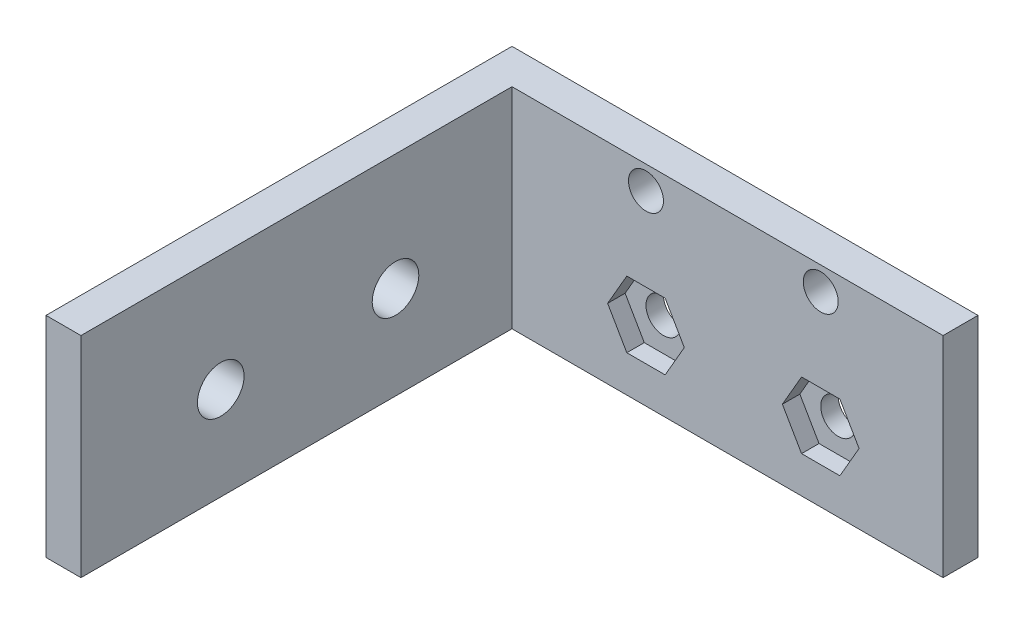
ISO-10303-21;
HEADER;
FILE_DESCRIPTION(('STEP AP214'),'2;1');
FILE_NAME('part.step','',(''),(''),'','','');
FILE_SCHEMA(('AUTOMOTIVE_DESIGN { 1 0 10303 214 1 1 1 1 }'));
ENDSEC;
DATA;
#1=APPLICATION_CONTEXT('core data for automotive mechanical design processes');
#2=APPLICATION_PROTOCOL_DEFINITION('international standard','automotive_design',2000,#1);
#3=PRODUCT_CONTEXT('',#1,'mechanical');
#4=PRODUCT('Part','Part','',(#3));
#5=PRODUCT_RELATED_PRODUCT_CATEGORY('part','',(#4));
#6=PRODUCT_DEFINITION_FORMATION('','',#4);
#7=PRODUCT_DEFINITION_CONTEXT('part definition',#1,'design');
#8=PRODUCT_DEFINITION('design','',#6,#7);
#9=PRODUCT_DEFINITION_SHAPE('','',#8);
#10=(LENGTH_UNIT() NAMED_UNIT(*) SI_UNIT(.MILLI.,.METRE.));
#11=(NAMED_UNIT(*) PLANE_ANGLE_UNIT() SI_UNIT($,.RADIAN.));
#12=(NAMED_UNIT(*) SI_UNIT($,.STERADIAN.) SOLID_ANGLE_UNIT());
#13=UNCERTAINTY_MEASURE_WITH_UNIT(LENGTH_MEASURE(1.E-05),#10,'distance_accuracy_value','');
#14=(GEOMETRIC_REPRESENTATION_CONTEXT(3) GLOBAL_UNCERTAINTY_ASSIGNED_CONTEXT((#13)) GLOBAL_UNIT_ASSIGNED_CONTEXT((#10,
#11,#12)) REPRESENTATION_CONTEXT('',''));
#15=CARTESIAN_POINT('',(0.,0.,0.));
#16=DIRECTION('',(0.,0.,1.));
#17=DIRECTION('',(1.,0.,0.));
#18=AXIS2_PLACEMENT_3D('',#15,#16,#17);
#19=CARTESIAN_POINT('',(29.5,6.,0.));
#20=DIRECTION('',(0.,0.,1.));
#21=DIRECTION('',(1.,0.,0.));
#22=AXIS2_PLACEMENT_3D('',#19,#20,#21);
#23=CYLINDRICAL_SURFACE('',#22,1.5);
#24=CARTESIAN_POINT('',(29.5,6.,0.));
#25=DIRECTION('',(0.,0.,1.));
#26=DIRECTION('',(1.,0.,0.));
#27=AXIS2_PLACEMENT_3D('',#24,#25,#26);
#28=CIRCLE('',#27,1.5);
#29=CARTESIAN_POINT('',(31.,6.,0.));
#30=VERTEX_POINT('',#29);
#31=EDGE_CURVE('E272',#30,#30,#28,.T.);
#32=ORIENTED_EDGE('',*,*,#31,.F.);
#33=EDGE_LOOP('',(#32));
#34=FACE_BOUND('',#33,.T.);
#35=CARTESIAN_POINT('',(29.5,6.,1.5));
#36=DIRECTION('',(0.,0.,1.));
#37=DIRECTION('',(1.,0.,0.));
#38=AXIS2_PLACEMENT_3D('',#35,#36,#37);
#39=CIRCLE('',#38,1.5);
#40=CARTESIAN_POINT('',(31.,6.,1.5));
#41=VERTEX_POINT('',#40);
#42=EDGE_CURVE('E37',#41,#41,#39,.F.);
#43=ORIENTED_EDGE('',*,*,#42,.F.);
#44=EDGE_LOOP('',(#43));
#45=FACE_BOUND('',#44,.T.);
#46=ADVANCED_FACE('F33',(#34,#45),#23,.F.);
#47=CARTESIAN_POINT('',(14.5,6.,0.));
#48=DIRECTION('',(0.,0.,1.));
#49=DIRECTION('',(1.,0.,0.));
#50=AXIS2_PLACEMENT_3D('',#47,#48,#49);
#51=CYLINDRICAL_SURFACE('',#50,1.5);
#52=CARTESIAN_POINT('',(14.5,6.,0.));
#53=DIRECTION('',(0.,0.,1.));
#54=DIRECTION('',(1.,0.,0.));
#55=AXIS2_PLACEMENT_3D('',#52,#53,#54);
#56=CIRCLE('',#55,1.5);
#57=CARTESIAN_POINT('',(16.,6.,0.));
#58=VERTEX_POINT('',#57);
#59=EDGE_CURVE('E282',#58,#58,#56,.T.);
#60=ORIENTED_EDGE('',*,*,#59,.F.);
#61=EDGE_LOOP('',(#60));
#62=FACE_BOUND('',#61,.T.);
#63=CARTESIAN_POINT('',(14.5,6.,1.5));
#64=DIRECTION('',(0.,0.,1.));
#65=DIRECTION('',(1.,0.,0.));
#66=AXIS2_PLACEMENT_3D('',#63,#64,#65);
#67=CIRCLE('',#66,1.5);
#68=CARTESIAN_POINT('',(16.,6.,1.5));
#69=VERTEX_POINT('',#68);
#70=EDGE_CURVE('E252',#69,#69,#67,.F.);
#71=ORIENTED_EDGE('',*,*,#70,.F.);
#72=EDGE_LOOP('',(#71));
#73=FACE_BOUND('',#72,.T.);
#74=ADVANCED_FACE('F338',(#62,#73),#51,.F.);
#75=CARTESIAN_POINT('',(0.,0.,3.));
#76=DIRECTION('',(0.,0.,-1.));
#77=DIRECTION('',(-1.,0.,0.));
#78=AXIS2_PLACEMENT_3D('',#75,#76,#77);
#79=PLANE('',#78);
#80=DIRECTION('',(-1.,0.,0.));
#81=VECTOR('',#80,1.);
#82=CARTESIAN_POINT('',(31.1454482671904,8.85,3.));
#83=LINE('',#82,#81);
#84=CARTESIAN_POINT('',(31.1454482671904,8.85,3.));
#85=VERTEX_POINT('',#84);
#86=CARTESIAN_POINT('',(27.8545517328096,8.85,3.));
#87=VERTEX_POINT('',#86);
#88=EDGE_CURVE('E196',#85,#87,#83,.T.);
#89=ORIENTED_EDGE('',*,*,#88,.F.);
#90=DIRECTION('',(-0.5,0.866025403784439,0.));
#91=VECTOR('',#90,1.);
#92=CARTESIAN_POINT('',(32.7908965343809,6.,3.));
#93=LINE('',#92,#91);
#94=CARTESIAN_POINT('',(32.7908965343809,6.,3.));
#95=VERTEX_POINT('',#94);
#96=EDGE_CURVE('E50',#95,#85,#93,.T.);
#97=ORIENTED_EDGE('',*,*,#96,.F.);
#98=DIRECTION('',(0.499999999999998,0.86602540378444,0.));
#99=VECTOR('',#98,1.);
#100=CARTESIAN_POINT('',(31.1454482671904,3.15,3.));
#101=LINE('',#100,#99);
#102=CARTESIAN_POINT('',(31.1454482671904,3.15,3.));
#103=VERTEX_POINT('',#102);
#104=EDGE_CURVE('E182',#103,#95,#101,.T.);
#105=ORIENTED_EDGE('',*,*,#104,.F.);
#106=DIRECTION('',(1.,0.,0.));
#107=VECTOR('',#106,1.);
#108=CARTESIAN_POINT('',(27.8545517328096,3.15,3.));
#109=LINE('',#108,#107);
#110=CARTESIAN_POINT('',(27.8545517328096,3.15,3.));
#111=VERTEX_POINT('',#110);
#112=EDGE_CURVE('E185',#111,#103,#109,.T.);
#113=ORIENTED_EDGE('',*,*,#112,.F.);
#114=DIRECTION('',(0.5,-0.866025403784439,0.));
#115=VECTOR('',#114,1.);
#116=CARTESIAN_POINT('',(26.2091034656191,6.00000000000001,3.));
#117=LINE('',#116,#115);
#118=CARTESIAN_POINT('',(26.2091034656191,6.00000000000001,3.));
#119=VERTEX_POINT('',#118);
#120=EDGE_CURVE('E201',#119,#111,#117,.T.);
#121=ORIENTED_EDGE('',*,*,#120,.F.);
#122=DIRECTION('',(-0.500000000000001,-0.866025403784438,0.));
#123=VECTOR('',#122,1.);
#124=CARTESIAN_POINT('',(27.8545517328096,8.85,3.));
#125=LINE('',#124,#123);
#126=EDGE_CURVE('E198',#87,#119,#125,.T.);
#127=ORIENTED_EDGE('',*,*,#126,.F.);
#128=EDGE_LOOP('',(#89,#97,#105,#113,#121,#127));
#129=FACE_BOUND('',#128,.T.);
#130=DIRECTION('',(-1.,0.,0.));
#131=VECTOR('',#130,1.);
#132=CARTESIAN_POINT('',(16.1454482671904,8.85,3.));
#133=LINE('',#132,#131);
#134=CARTESIAN_POINT('',(16.1454482671904,8.85,3.));
#135=VERTEX_POINT('',#134);
#136=CARTESIAN_POINT('',(12.8545517328096,8.85,3.));
#137=VERTEX_POINT('',#136);
#138=EDGE_CURVE('E236',#135,#137,#133,.T.);
#139=ORIENTED_EDGE('',*,*,#138,.F.);
#140=DIRECTION('',(-0.5,0.866025403784438,0.));
#141=VECTOR('',#140,1.);
#142=CARTESIAN_POINT('',(17.7908965343809,6.,3.));
#143=LINE('',#142,#141);
#144=CARTESIAN_POINT('',(17.7908965343809,6.,3.));
#145=VERTEX_POINT('',#144);
#146=EDGE_CURVE('E58',#145,#135,#143,.T.);
#147=ORIENTED_EDGE('',*,*,#146,.F.);
#148=DIRECTION('',(0.5,0.866025403784439,0.));
#149=VECTOR('',#148,1.);
#150=CARTESIAN_POINT('',(16.1454482671904,3.15,3.));
#151=LINE('',#150,#149);
#152=CARTESIAN_POINT('',(16.1454482671904,3.15,3.));
#153=VERTEX_POINT('',#152);
#154=EDGE_CURVE('E219',#153,#145,#151,.T.);
#155=ORIENTED_EDGE('',*,*,#154,.F.);
#156=DIRECTION('',(1.,0.,0.));
#157=VECTOR('',#156,1.);
#158=CARTESIAN_POINT('',(12.8545517328096,3.15,3.));
#159=LINE('',#158,#157);
#160=CARTESIAN_POINT('',(12.8545517328096,3.15,3.));
#161=VERTEX_POINT('',#160);
#162=EDGE_CURVE('E245',#161,#153,#159,.T.);
#163=ORIENTED_EDGE('',*,*,#162,.F.);
#164=DIRECTION('',(0.5,-0.866025403784439,0.));
#165=VECTOR('',#164,1.);
#166=CARTESIAN_POINT('',(11.2091034656191,6.,3.));
#167=LINE('',#166,#165);
#168=CARTESIAN_POINT('',(11.2091034656191,6.,3.));
#169=VERTEX_POINT('',#168);
#170=EDGE_CURVE('E242',#169,#161,#167,.T.);
#171=ORIENTED_EDGE('',*,*,#170,.F.);
#172=DIRECTION('',(-0.5,-0.866025403784439,0.));
#173=VECTOR('',#172,1.);
#174=CARTESIAN_POINT('',(12.8545517328096,8.85,3.));
#175=LINE('',#174,#173);
#176=EDGE_CURVE('E239',#137,#169,#175,.T.);
#177=ORIENTED_EDGE('',*,*,#176,.F.);
#178=EDGE_LOOP('',(#139,#147,#155,#163,#171,#177));
#179=FACE_BOUND('',#178,.T.);
#180=CARTESIAN_POINT('',(29.5,16.,3.));
#181=DIRECTION('',(0.,0.,1.));
#182=DIRECTION('',(1.,0.,0.));
#183=AXIS2_PLACEMENT_3D('',#180,#181,#182);
#184=CIRCLE('',#183,1.5);
#185=CARTESIAN_POINT('',(31.,16.,3.));
#186=VERTEX_POINT('',#185);
#187=EDGE_CURVE('E279',#186,#186,#184,.T.);
#188=ORIENTED_EDGE('',*,*,#187,.F.);
#189=EDGE_LOOP('',(#188));
#190=FACE_BOUND('',#189,.T.);
#191=CARTESIAN_POINT('',(14.5,16.,3.));
#192=DIRECTION('',(0.,0.,1.));
#193=DIRECTION('',(1.,0.,0.));
#194=AXIS2_PLACEMENT_3D('',#191,#192,#193);
#195=CIRCLE('',#194,1.49999999999999);
#196=CARTESIAN_POINT('',(16.,16.,3.));
#197=VERTEX_POINT('',#196);
#198=EDGE_CURVE('E278',#197,#197,#195,.T.);
#199=ORIENTED_EDGE('',*,*,#198,.F.);
#200=EDGE_LOOP('',(#199));
#201=FACE_BOUND('',#200,.T.);
#202=DIRECTION('',(0.,1.,0.));
#203=VECTOR('',#202,1.);
#204=CARTESIAN_POINT('',(3.,18.,3.));
#205=LINE('',#204,#203);
#206=CARTESIAN_POINT('',(3.,0.,3.));
#207=VERTEX_POINT('',#206);
#208=CARTESIAN_POINT('',(3.,18.,3.));
#209=VERTEX_POINT('',#208);
#210=EDGE_CURVE('E290',#207,#209,#205,.T.);
#211=ORIENTED_EDGE('',*,*,#210,.F.);
#212=DIRECTION('',(1.,0.,0.));
#213=VECTOR('',#212,1.);
#214=CARTESIAN_POINT('',(0.,0.,3.));
#215=LINE('',#214,#213);
#216=CARTESIAN_POINT('',(40.,0.,3.));
#217=VERTEX_POINT('',#216);
#218=EDGE_CURVE('E312',#207,#217,#215,.T.);
#219=ORIENTED_EDGE('',*,*,#218,.T.);
#220=DIRECTION('',(0.,1.,0.));
#221=VECTOR('',#220,1.);
#222=CARTESIAN_POINT('',(40.,0.,3.));
#223=LINE('',#222,#221);
#224=CARTESIAN_POINT('',(40.,18.,3.));
#225=VERTEX_POINT('',#224);
#226=EDGE_CURVE('E314',#217,#225,#223,.T.);
#227=ORIENTED_EDGE('',*,*,#226,.T.);
#228=DIRECTION('',(-1.,0.,0.));
#229=VECTOR('',#228,1.);
#230=CARTESIAN_POINT('',(0.,18.,3.));
#231=LINE('',#230,#229);
#232=EDGE_CURVE('E317',#225,#209,#231,.T.);
#233=ORIENTED_EDGE('',*,*,#232,.T.);
#234=EDGE_LOOP('',(#211,#219,#227,#233));
#235=FACE_BOUND('',#234,.T.);
#236=ADVANCED_FACE('F340',(#129,#179,#190,#201,#235),#79,.F.);
#237=CARTESIAN_POINT('',(0.,0.,3.));
#238=DIRECTION('',(1.,0.,0.));
#239=DIRECTION('',(0.,0.,-1.));
#240=AXIS2_PLACEMENT_3D('',#237,#238,#239);
#241=PLANE('',#240);
#242=CARTESIAN_POINT('',(0.,8.,13.));
#243=DIRECTION('',(1.,0.,0.));
#244=DIRECTION('',(0.,1.,0.));
#245=AXIS2_PLACEMENT_3D('',#242,#243,#244);
#246=CIRCLE('',#245,2.);
#247=CARTESIAN_POINT('',(0.,10.,13.));
#248=VERTEX_POINT('',#247);
#249=EDGE_CURVE('E262',#248,#248,#246,.T.);
#250=ORIENTED_EDGE('',*,*,#249,.T.);
#251=EDGE_LOOP('',(#250));
#252=FACE_BOUND('',#251,.T.);
#253=CARTESIAN_POINT('',(0.,8.,28.));
#254=DIRECTION('',(1.,0.,0.));
#255=DIRECTION('',(0.,1.,0.));
#256=AXIS2_PLACEMENT_3D('',#253,#254,#255);
#257=CIRCLE('',#256,2.);
#258=CARTESIAN_POINT('',(0.,10.,28.));
#259=VERTEX_POINT('',#258);
#260=EDGE_CURVE('E269',#259,#259,#257,.T.);
#261=ORIENTED_EDGE('',*,*,#260,.T.);
#262=EDGE_LOOP('',(#261));
#263=FACE_BOUND('',#262,.T.);
#264=DIRECTION('',(0.,-1.,0.));
#265=VECTOR('',#264,1.);
#266=CARTESIAN_POINT('',(0.,0.,0.));
#267=LINE('',#266,#265);
#268=CARTESIAN_POINT('',(0.,18.,0.));
#269=VERTEX_POINT('',#268);
#270=CARTESIAN_POINT('',(0.,0.,0.));
#271=VERTEX_POINT('',#270);
#272=EDGE_CURVE('E311',#269,#271,#267,.T.);
#273=ORIENTED_EDGE('',*,*,#272,.T.);
#274=DIRECTION('',(0.,0.,-1.));
#275=VECTOR('',#274,1.);
#276=CARTESIAN_POINT('',(0.,0.,3.));
#277=LINE('',#276,#275);
#278=CARTESIAN_POINT('',(0.,0.,40.));
#279=VERTEX_POINT('',#278);
#280=EDGE_CURVE('E11',#279,#271,#277,.T.);
#281=ORIENTED_EDGE('',*,*,#280,.F.);
#282=DIRECTION('',(0.,-1.,0.));
#283=VECTOR('',#282,1.);
#284=CARTESIAN_POINT('',(0.,18.,40.));
#285=LINE('',#284,#283);
#286=CARTESIAN_POINT('',(0.,18.,40.));
#287=VERTEX_POINT('',#286);
#288=EDGE_CURVE('E293',#287,#279,#285,.T.);
#289=ORIENTED_EDGE('',*,*,#288,.F.);
#290=DIRECTION('',(0.,0.,-1.));
#291=VECTOR('',#290,1.);
#292=CARTESIAN_POINT('',(0.,18.,3.));
#293=LINE('',#292,#291);
#294=EDGE_CURVE('E319',#287,#269,#293,.T.);
#295=ORIENTED_EDGE('',*,*,#294,.T.);
#296=EDGE_LOOP('',(#273,#281,#289,#295));
#297=FACE_BOUND('',#296,.T.);
#298=ADVANCED_FACE('F35',(#252,#263,#297),#241,.F.);
#299=CARTESIAN_POINT('',(0.,0.,3.));
#300=DIRECTION('',(0.,1.,0.));
#301=DIRECTION('',(0.,0.,1.));
#302=AXIS2_PLACEMENT_3D('',#299,#300,#301);
#303=PLANE('',#302);
#304=DIRECTION('',(1.,0.,0.));
#305=VECTOR('',#304,1.);
#306=CARTESIAN_POINT('',(0.,0.,0.));
#307=LINE('',#306,#305);
#308=CARTESIAN_POINT('',(40.,0.,0.));
#309=VERTEX_POINT('',#308);
#310=EDGE_CURVE('E322',#271,#309,#307,.T.);
#311=ORIENTED_EDGE('',*,*,#310,.T.);
#312=DIRECTION('',(0.,0.,-1.));
#313=VECTOR('',#312,1.);
#314=CARTESIAN_POINT('',(40.,0.,3.));
#315=LINE('',#314,#313);
#316=EDGE_CURVE('E42',#217,#309,#315,.T.);
#317=ORIENTED_EDGE('',*,*,#316,.F.);
#318=ORIENTED_EDGE('',*,*,#218,.F.);
#319=DIRECTION('',(0.,0.,-1.));
#320=VECTOR('',#319,1.);
#321=CARTESIAN_POINT('',(3.,0.,40.));
#322=LINE('',#321,#320);
#323=CARTESIAN_POINT('',(3.,0.,40.));
#324=VERTEX_POINT('',#323);
#325=EDGE_CURVE('E308',#324,#207,#322,.T.);
#326=ORIENTED_EDGE('',*,*,#325,.F.);
#327=DIRECTION('',(1.,0.,0.));
#328=VECTOR('',#327,1.);
#329=CARTESIAN_POINT('',(0.,0.,40.));
#330=LINE('',#329,#328);
#331=EDGE_CURVE('E296',#279,#324,#330,.T.);
#332=ORIENTED_EDGE('',*,*,#331,.F.);
#333=ORIENTED_EDGE('',*,*,#280,.T.);
#334=EDGE_LOOP('',(#311,#317,#318,#326,#332,#333));
#335=FACE_BOUND('',#334,.T.);
#336=ADVANCED_FACE('F378',(#335),#303,.F.);
#337=CARTESIAN_POINT('',(40.,0.,3.));
#338=DIRECTION('',(-1.,0.,0.));
#339=DIRECTION('',(0.,0.,1.));
#340=AXIS2_PLACEMENT_3D('',#337,#338,#339);
#341=PLANE('',#340);
#342=DIRECTION('',(0.,1.,0.));
#343=VECTOR('',#342,1.);
#344=CARTESIAN_POINT('',(40.,0.,0.));
#345=LINE('',#344,#343);
#346=CARTESIAN_POINT('',(40.,18.,0.));
#347=VERTEX_POINT('',#346);
#348=EDGE_CURVE('E324',#309,#347,#345,.T.);
#349=ORIENTED_EDGE('',*,*,#348,.T.);
#350=DIRECTION('',(0.,0.,-1.));
#351=VECTOR('',#350,1.);
#352=CARTESIAN_POINT('',(40.,18.,3.));
#353=LINE('',#352,#351);
#354=EDGE_CURVE('E329',#225,#347,#353,.T.);
#355=ORIENTED_EDGE('',*,*,#354,.F.);
#356=ORIENTED_EDGE('',*,*,#226,.F.);
#357=ORIENTED_EDGE('',*,*,#316,.T.);
#358=EDGE_LOOP('',(#349,#355,#356,#357));
#359=FACE_BOUND('',#358,.T.);
#360=ADVANCED_FACE('F375',(#359),#341,.F.);
#361=CARTESIAN_POINT('',(0.,18.,3.));
#362=DIRECTION('',(0.,-1.,0.));
#363=DIRECTION('',(0.,0.,-1.));
#364=AXIS2_PLACEMENT_3D('',#361,#362,#363);
#365=PLANE('',#364);
#366=DIRECTION('',(-1.,0.,0.));
#367=VECTOR('',#366,1.);
#368=CARTESIAN_POINT('',(0.,18.,0.));
#369=LINE('',#368,#367);
#370=EDGE_CURVE('E315',#347,#269,#369,.T.);
#371=ORIENTED_EDGE('',*,*,#370,.T.);
#372=ORIENTED_EDGE('',*,*,#294,.F.);
#373=DIRECTION('',(-1.,0.,0.));
#374=VECTOR('',#373,1.);
#375=CARTESIAN_POINT('',(0.,18.,40.));
#376=LINE('',#375,#374);
#377=CARTESIAN_POINT('',(3.,18.,40.));
#378=VERTEX_POINT('',#377);
#379=EDGE_CURVE('E300',#378,#287,#376,.T.);
#380=ORIENTED_EDGE('',*,*,#379,.F.);
#381=DIRECTION('',(0.,0.,-1.));
#382=VECTOR('',#381,1.);
#383=CARTESIAN_POINT('',(3.,18.,40.));
#384=LINE('',#383,#382);
#385=EDGE_CURVE('E303',#378,#209,#384,.T.);
#386=ORIENTED_EDGE('',*,*,#385,.T.);
#387=ORIENTED_EDGE('',*,*,#232,.F.);
#388=ORIENTED_EDGE('',*,*,#354,.T.);
#389=EDGE_LOOP('',(#371,#372,#380,#386,#387,#388));
#390=FACE_BOUND('',#389,.T.);
#391=ADVANCED_FACE('F371',(#390),#365,.F.);
#392=CARTESIAN_POINT('',(0.,0.,0.));
#393=DIRECTION('',(0.,0.,-1.));
#394=DIRECTION('',(-1.,0.,0.));
#395=AXIS2_PLACEMENT_3D('',#392,#393,#394);
#396=PLANE('',#395);
#397=CARTESIAN_POINT('',(29.5,16.,0.));
#398=DIRECTION('',(0.,0.,1.));
#399=DIRECTION('',(1.,0.,0.));
#400=AXIS2_PLACEMENT_3D('',#397,#398,#399);
#401=CIRCLE('',#400,1.5);
#402=CARTESIAN_POINT('',(31.,16.,0.));
#403=VERTEX_POINT('',#402);
#404=EDGE_CURVE('E275',#403,#403,#401,.T.);
#405=ORIENTED_EDGE('',*,*,#404,.T.);
#406=EDGE_LOOP('',(#405));
#407=FACE_BOUND('',#406,.T.);
#408=ORIENTED_EDGE('',*,*,#59,.T.);
#409=EDGE_LOOP('',(#408));
#410=FACE_BOUND('',#409,.T.);
#411=ORIENTED_EDGE('',*,*,#31,.T.);
#412=EDGE_LOOP('',(#411));
#413=FACE_BOUND('',#412,.T.);
#414=CARTESIAN_POINT('',(14.5,16.,0.));
#415=DIRECTION('',(0.,0.,1.));
#416=DIRECTION('',(1.,0.,0.));
#417=AXIS2_PLACEMENT_3D('',#414,#415,#416);
#418=CIRCLE('',#417,1.49999999999999);
#419=CARTESIAN_POINT('',(16.,16.,0.));
#420=VERTEX_POINT('',#419);
#421=EDGE_CURVE('E287',#420,#420,#418,.T.);
#422=ORIENTED_EDGE('',*,*,#421,.T.);
#423=EDGE_LOOP('',(#422));
#424=FACE_BOUND('',#423,.T.);
#425=ORIENTED_EDGE('',*,*,#272,.F.);
#426=ORIENTED_EDGE('',*,*,#370,.F.);
#427=ORIENTED_EDGE('',*,*,#348,.F.);
#428=ORIENTED_EDGE('',*,*,#310,.F.);
#429=EDGE_LOOP('',(#425,#426,#427,#428));
#430=FACE_BOUND('',#429,.T.);
#431=ADVANCED_FACE('F366',(#407,#410,#413,#424,#430),#396,.T.);
#432=CARTESIAN_POINT('',(3.,18.,40.));
#433=DIRECTION('',(-1.,0.,0.));
#434=DIRECTION('',(0.,-1.,0.));
#435=AXIS2_PLACEMENT_3D('',#432,#433,#434);
#436=PLANE('',#435);
#437=CARTESIAN_POINT('',(3.,8.,13.));
#438=DIRECTION('',(1.,0.,0.));
#439=DIRECTION('',(0.,1.,0.));
#440=AXIS2_PLACEMENT_3D('',#437,#438,#439);
#441=CIRCLE('',#440,2.);
#442=CARTESIAN_POINT('',(3.,10.,13.));
#443=VERTEX_POINT('',#442);
#444=EDGE_CURVE('E266',#443,#443,#441,.T.);
#445=ORIENTED_EDGE('',*,*,#444,.F.);
#446=EDGE_LOOP('',(#445));
#447=FACE_BOUND('',#446,.T.);
#448=CARTESIAN_POINT('',(3.,8.,28.));
#449=DIRECTION('',(1.,0.,0.));
#450=DIRECTION('',(0.,1.,0.));
#451=AXIS2_PLACEMENT_3D('',#448,#449,#450);
#452=CIRCLE('',#451,2.);
#453=CARTESIAN_POINT('',(3.,10.,28.));
#454=VERTEX_POINT('',#453);
#455=EDGE_CURVE('E265',#454,#454,#452,.T.);
#456=ORIENTED_EDGE('',*,*,#455,.F.);
#457=EDGE_LOOP('',(#456));
#458=FACE_BOUND('',#457,.T.);
#459=ORIENTED_EDGE('',*,*,#210,.T.);
#460=ORIENTED_EDGE('',*,*,#385,.F.);
#461=DIRECTION('',(0.,1.,0.));
#462=VECTOR('',#461,1.);
#463=CARTESIAN_POINT('',(3.,18.,40.));
#464=LINE('',#463,#462);
#465=EDGE_CURVE('E298',#324,#378,#464,.T.);
#466=ORIENTED_EDGE('',*,*,#465,.F.);
#467=ORIENTED_EDGE('',*,*,#325,.T.);
#468=EDGE_LOOP('',(#459,#460,#466,#467));
#469=FACE_BOUND('',#468,.T.);
#470=ADVANCED_FACE('F363',(#447,#458,#469),#436,.F.);
#471=CARTESIAN_POINT('',(0.,0.,40.));
#472=DIRECTION('',(0.,0.,1.));
#473=DIRECTION('',(1.,0.,0.));
#474=AXIS2_PLACEMENT_3D('',#471,#472,#473);
#475=PLANE('',#474);
#476=ORIENTED_EDGE('',*,*,#288,.T.);
#477=ORIENTED_EDGE('',*,*,#331,.T.);
#478=ORIENTED_EDGE('',*,*,#465,.T.);
#479=ORIENTED_EDGE('',*,*,#379,.T.);
#480=EDGE_LOOP('',(#476,#477,#478,#479));
#481=FACE_BOUND('',#480,.T.);
#482=ADVANCED_FACE('F359',(#481),#475,.T.);
#483=CARTESIAN_POINT('',(14.5,16.,0.));
#484=DIRECTION('',(0.,0.,1.));
#485=DIRECTION('',(1.,0.,0.));
#486=AXIS2_PLACEMENT_3D('',#483,#484,#485);
#487=CYLINDRICAL_SURFACE('',#486,1.49999999999999);
#488=ORIENTED_EDGE('',*,*,#421,.F.);
#489=EDGE_LOOP('',(#488));
#490=FACE_BOUND('',#489,.T.);
#491=ORIENTED_EDGE('',*,*,#198,.T.);
#492=EDGE_LOOP('',(#491));
#493=FACE_BOUND('',#492,.T.);
#494=ADVANCED_FACE('F356',(#490,#493),#487,.F.);
#495=CARTESIAN_POINT('',(29.5,16.,0.));
#496=DIRECTION('',(0.,0.,1.));
#497=DIRECTION('',(1.,0.,0.));
#498=AXIS2_PLACEMENT_3D('',#495,#496,#497);
#499=CYLINDRICAL_SURFACE('',#498,1.5);
#500=ORIENTED_EDGE('',*,*,#404,.F.);
#501=EDGE_LOOP('',(#500));
#502=FACE_BOUND('',#501,.T.);
#503=ORIENTED_EDGE('',*,*,#187,.T.);
#504=EDGE_LOOP('',(#503));
#505=FACE_BOUND('',#504,.T.);
#506=ADVANCED_FACE('F353',(#502,#505),#499,.F.);
#507=CARTESIAN_POINT('',(0.,8.,28.));
#508=DIRECTION('',(1.,0.,0.));
#509=DIRECTION('',(0.,1.,0.));
#510=AXIS2_PLACEMENT_3D('',#507,#508,#509);
#511=CYLINDRICAL_SURFACE('',#510,2.);
#512=ORIENTED_EDGE('',*,*,#260,.F.);
#513=EDGE_LOOP('',(#512));
#514=FACE_BOUND('',#513,.T.);
#515=ORIENTED_EDGE('',*,*,#455,.T.);
#516=EDGE_LOOP('',(#515));
#517=FACE_BOUND('',#516,.T.);
#518=ADVANCED_FACE('F411',(#514,#517),#511,.F.);
#519=CARTESIAN_POINT('',(0.,8.,13.));
#520=DIRECTION('',(1.,0.,0.));
#521=DIRECTION('',(0.,1.,0.));
#522=AXIS2_PLACEMENT_3D('',#519,#520,#521);
#523=CYLINDRICAL_SURFACE('',#522,2.);
#524=ORIENTED_EDGE('',*,*,#249,.F.);
#525=EDGE_LOOP('',(#524));
#526=FACE_BOUND('',#525,.T.);
#527=ORIENTED_EDGE('',*,*,#444,.T.);
#528=EDGE_LOOP('',(#527));
#529=FACE_BOUND('',#528,.T.);
#530=ADVANCED_FACE('F414',(#526,#529),#523,.F.);
#531=CARTESIAN_POINT('',(0.,0.,1.5));
#532=DIRECTION('',(0.,0.,1.));
#533=DIRECTION('',(1.,0.,0.));
#534=AXIS2_PLACEMENT_3D('',#531,#532,#533);
#535=PLANE('',#534);
#536=DIRECTION('',(-0.5,0.866025403784438,0.));
#537=VECTOR('',#536,1.);
#538=CARTESIAN_POINT('',(17.7908965343809,6.,1.5));
#539=LINE('',#538,#537);
#540=CARTESIAN_POINT('',(17.7908965343809,6.,1.5));
#541=VERTEX_POINT('',#540);
#542=CARTESIAN_POINT('',(16.1454482671904,8.85,1.5));
#543=VERTEX_POINT('',#542);
#544=EDGE_CURVE('E215',#541,#543,#539,.T.);
#545=ORIENTED_EDGE('',*,*,#544,.T.);
#546=DIRECTION('',(-1.,0.,0.));
#547=VECTOR('',#546,1.);
#548=CARTESIAN_POINT('',(16.1454482671904,8.85,1.5));
#549=LINE('',#548,#547);
#550=CARTESIAN_POINT('',(12.8545517328096,8.85,1.5));
#551=VERTEX_POINT('',#550);
#552=EDGE_CURVE('E218',#543,#551,#549,.T.);
#553=ORIENTED_EDGE('',*,*,#552,.T.);
#554=DIRECTION('',(-0.5,-0.866025403784439,0.));
#555=VECTOR('',#554,1.);
#556=CARTESIAN_POINT('',(12.8545517328096,8.85,1.5));
#557=LINE('',#556,#555);
#558=CARTESIAN_POINT('',(11.2091034656191,6.,1.5));
#559=VERTEX_POINT('',#558);
#560=EDGE_CURVE('E222',#551,#559,#557,.T.);
#561=ORIENTED_EDGE('',*,*,#560,.T.);
#562=DIRECTION('',(0.5,-0.866025403784439,0.));
#563=VECTOR('',#562,1.);
#564=CARTESIAN_POINT('',(11.2091034656191,6.,1.5));
#565=LINE('',#564,#563);
#566=CARTESIAN_POINT('',(12.8545517328096,3.15,1.5));
#567=VERTEX_POINT('',#566);
#568=EDGE_CURVE('E225',#559,#567,#565,.T.);
#569=ORIENTED_EDGE('',*,*,#568,.T.);
#570=DIRECTION('',(1.,0.,0.));
#571=VECTOR('',#570,1.);
#572=CARTESIAN_POINT('',(12.8545517328096,3.15,1.5));
#573=LINE('',#572,#571);
#574=CARTESIAN_POINT('',(16.1454482671904,3.15,1.5));
#575=VERTEX_POINT('',#574);
#576=EDGE_CURVE('E228',#567,#575,#573,.T.);
#577=ORIENTED_EDGE('',*,*,#576,.T.);
#578=DIRECTION('',(0.5,0.866025403784439,0.));
#579=VECTOR('',#578,1.);
#580=CARTESIAN_POINT('',(16.1454482671904,3.15,1.5));
#581=LINE('',#580,#579);
#582=EDGE_CURVE('E231',#575,#541,#581,.T.);
#583=ORIENTED_EDGE('',*,*,#582,.T.);
#584=EDGE_LOOP('',(#545,#553,#561,#569,#577,#583));
#585=FACE_BOUND('',#584,.T.);
#586=ORIENTED_EDGE('',*,*,#70,.T.);
#587=EDGE_LOOP('',(#586));
#588=FACE_BOUND('',#587,.T.);
#589=ADVANCED_FACE('F336',(#585,#588),#535,.T.);
#590=CARTESIAN_POINT('',(17.7908965343809,6.,1.5));
#591=DIRECTION('',(0.866025403784438,0.5,0.));
#592=DIRECTION('',(-0.5,0.866025403784439,0.));
#593=AXIS2_PLACEMENT_3D('',#590,#591,#592);
#594=PLANE('',#593);
#595=ORIENTED_EDGE('',*,*,#146,.T.);
#596=DIRECTION('',(0.,0.,1.));
#597=VECTOR('',#596,1.);
#598=CARTESIAN_POINT('',(16.1454482671904,8.85,1.5));
#599=LINE('',#598,#597);
#600=EDGE_CURVE('E234',#543,#135,#599,.T.);
#601=ORIENTED_EDGE('',*,*,#600,.F.);
#602=ORIENTED_EDGE('',*,*,#544,.F.);
#603=DIRECTION('',(0.,0.,1.));
#604=VECTOR('',#603,1.);
#605=CARTESIAN_POINT('',(17.7908965343809,6.,1.5));
#606=LINE('',#605,#604);
#607=EDGE_CURVE('E250',#541,#145,#606,.T.);
#608=ORIENTED_EDGE('',*,*,#607,.T.);
#609=EDGE_LOOP('',(#595,#601,#602,#608));
#610=FACE_BOUND('',#609,.T.);
#611=ADVANCED_FACE('F425',(#610),#594,.F.);
#612=CARTESIAN_POINT('',(16.1454482671904,3.15,1.5));
#613=DIRECTION('',(0.866025403784439,-0.5,0.));
#614=DIRECTION('',(0.5,0.866025403784439,0.));
#615=AXIS2_PLACEMENT_3D('',#612,#613,#614);
#616=PLANE('',#615);
#617=ORIENTED_EDGE('',*,*,#154,.T.);
#618=ORIENTED_EDGE('',*,*,#607,.F.);
#619=ORIENTED_EDGE('',*,*,#582,.F.);
#620=DIRECTION('',(0.,0.,1.));
#621=VECTOR('',#620,1.);
#622=CARTESIAN_POINT('',(16.1454482671904,3.15,1.5));
#623=LINE('',#622,#621);
#624=EDGE_CURVE('E253',#575,#153,#623,.T.);
#625=ORIENTED_EDGE('',*,*,#624,.T.);
#626=EDGE_LOOP('',(#617,#618,#619,#625));
#627=FACE_BOUND('',#626,.T.);
#628=ADVANCED_FACE('F428',(#627),#616,.F.);
#629=CARTESIAN_POINT('',(12.8545517328096,3.15,1.5));
#630=DIRECTION('',(0.,-1.,0.));
#631=DIRECTION('',(1.,0.,0.));
#632=AXIS2_PLACEMENT_3D('',#629,#630,#631);
#633=PLANE('',#632);
#634=ORIENTED_EDGE('',*,*,#162,.T.);
#635=ORIENTED_EDGE('',*,*,#624,.F.);
#636=ORIENTED_EDGE('',*,*,#576,.F.);
#637=DIRECTION('',(0.,0.,1.));
#638=VECTOR('',#637,1.);
#639=CARTESIAN_POINT('',(12.8545517328096,3.15,1.5));
#640=LINE('',#639,#638);
#641=EDGE_CURVE('E255',#567,#161,#640,.T.);
#642=ORIENTED_EDGE('',*,*,#641,.T.);
#643=EDGE_LOOP('',(#634,#635,#636,#642));
#644=FACE_BOUND('',#643,.T.);
#645=ADVANCED_FACE('F440',(#644),#633,.F.);
#646=CARTESIAN_POINT('',(11.2091034656191,6.,1.5));
#647=DIRECTION('',(-0.866025403784439,-0.5,0.));
#648=DIRECTION('',(0.5,-0.866025403784439,0.));
#649=AXIS2_PLACEMENT_3D('',#646,#647,#648);
#650=PLANE('',#649);
#651=ORIENTED_EDGE('',*,*,#170,.T.);
#652=ORIENTED_EDGE('',*,*,#641,.F.);
#653=ORIENTED_EDGE('',*,*,#568,.F.);
#654=DIRECTION('',(0.,0.,1.));
#655=VECTOR('',#654,1.);
#656=CARTESIAN_POINT('',(11.2091034656191,6.,1.5));
#657=LINE('',#656,#655);
#658=EDGE_CURVE('E257',#559,#169,#657,.T.);
#659=ORIENTED_EDGE('',*,*,#658,.T.);
#660=EDGE_LOOP('',(#651,#652,#653,#659));
#661=FACE_BOUND('',#660,.T.);
#662=ADVANCED_FACE('F436',(#661),#650,.F.);
#663=CARTESIAN_POINT('',(12.8545517328096,8.85,1.5));
#664=DIRECTION('',(-0.866025403784439,0.5,0.));
#665=DIRECTION('',(-0.5,-0.866025403784439,0.));
#666=AXIS2_PLACEMENT_3D('',#663,#664,#665);
#667=PLANE('',#666);
#668=ORIENTED_EDGE('',*,*,#176,.T.);
#669=ORIENTED_EDGE('',*,*,#658,.F.);
#670=ORIENTED_EDGE('',*,*,#560,.F.);
#671=DIRECTION('',(0.,0.,1.));
#672=VECTOR('',#671,1.);
#673=CARTESIAN_POINT('',(12.8545517328096,8.85,1.5));
#674=LINE('',#673,#672);
#675=EDGE_CURVE('E259',#551,#137,#674,.T.);
#676=ORIENTED_EDGE('',*,*,#675,.T.);
#677=EDGE_LOOP('',(#668,#669,#670,#676));
#678=FACE_BOUND('',#677,.T.);
#679=ADVANCED_FACE('F432',(#678),#667,.F.);
#680=CARTESIAN_POINT('',(16.1454482671904,8.85,1.5));
#681=DIRECTION('',(0.,1.,0.));
#682=DIRECTION('',(-1.,0.,0.));
#683=AXIS2_PLACEMENT_3D('',#680,#681,#682);
#684=PLANE('',#683);
#685=ORIENTED_EDGE('',*,*,#138,.T.);
#686=ORIENTED_EDGE('',*,*,#675,.F.);
#687=ORIENTED_EDGE('',*,*,#552,.F.);
#688=ORIENTED_EDGE('',*,*,#600,.T.);
#689=EDGE_LOOP('',(#685,#686,#687,#688));
#690=FACE_BOUND('',#689,.T.);
#691=ADVANCED_FACE('F429',(#690),#684,.F.);
#692=CARTESIAN_POINT('',(0.,0.,1.5));
#693=DIRECTION('',(0.,0.,1.));
#694=DIRECTION('',(1.,0.,0.));
#695=AXIS2_PLACEMENT_3D('',#692,#693,#694);
#696=PLANE('',#695);
#697=DIRECTION('',(-0.5,0.866025403784439,0.));
#698=VECTOR('',#697,1.);
#699=CARTESIAN_POINT('',(32.7908965343809,6.,1.5));
#700=LINE('',#699,#698);
#701=CARTESIAN_POINT('',(32.7908965343809,6.,1.5));
#702=VERTEX_POINT('',#701);
#703=CARTESIAN_POINT('',(31.1454482671904,8.85,1.5));
#704=VERTEX_POINT('',#703);
#705=EDGE_CURVE('E162',#702,#704,#700,.T.);
#706=ORIENTED_EDGE('',*,*,#705,.T.);
#707=DIRECTION('',(-1.,0.,0.));
#708=VECTOR('',#707,1.);
#709=CARTESIAN_POINT('',(31.1454482671904,8.85,1.5));
#710=LINE('',#709,#708);
#711=CARTESIAN_POINT('',(27.8545517328096,8.85,1.5));
#712=VERTEX_POINT('',#711);
#713=EDGE_CURVE('E171',#704,#712,#710,.T.);
#714=ORIENTED_EDGE('',*,*,#713,.T.);
#715=DIRECTION('',(-0.500000000000001,-0.866025403784438,0.));
#716=VECTOR('',#715,1.);
#717=CARTESIAN_POINT('',(27.8545517328096,8.85,1.5));
#718=LINE('',#717,#716);
#719=CARTESIAN_POINT('',(26.2091034656191,6.00000000000001,1.5));
#720=VERTEX_POINT('',#719);
#721=EDGE_CURVE('E176',#712,#720,#718,.T.);
#722=ORIENTED_EDGE('',*,*,#721,.T.);
#723=DIRECTION('',(0.5,-0.866025403784439,0.));
#724=VECTOR('',#723,1.);
#725=CARTESIAN_POINT('',(26.2091034656191,6.00000000000001,1.5));
#726=LINE('',#725,#724);
#727=CARTESIAN_POINT('',(27.8545517328096,3.15,1.5));
#728=VERTEX_POINT('',#727);
#729=EDGE_CURVE('E189',#720,#728,#726,.T.);
#730=ORIENTED_EDGE('',*,*,#729,.T.);
#731=DIRECTION('',(1.,0.,0.));
#732=VECTOR('',#731,1.);
#733=CARTESIAN_POINT('',(27.8545517328096,3.15,1.5));
#734=LINE('',#733,#732);
#735=CARTESIAN_POINT('',(31.1454482671904,3.15,1.5));
#736=VERTEX_POINT('',#735);
#737=EDGE_CURVE('E192',#728,#736,#734,.T.);
#738=ORIENTED_EDGE('',*,*,#737,.T.);
#739=DIRECTION('',(0.499999999999998,0.86602540378444,0.));
#740=VECTOR('',#739,1.);
#741=CARTESIAN_POINT('',(31.1454482671904,3.15,1.5));
#742=LINE('',#741,#740);
#743=EDGE_CURVE('E168',#736,#702,#742,.T.);
#744=ORIENTED_EDGE('',*,*,#743,.T.);
#745=EDGE_LOOP('',(#706,#714,#722,#730,#738,#744));
#746=FACE_BOUND('',#745,.T.);
#747=ORIENTED_EDGE('',*,*,#42,.T.);
#748=EDGE_LOOP('',(#747));
#749=FACE_BOUND('',#748,.T.);
#750=ADVANCED_FACE('F178',(#746,#749),#696,.T.);
#751=CARTESIAN_POINT('',(32.7908965343809,6.,1.5));
#752=DIRECTION('',(0.866025403784439,0.5,0.));
#753=DIRECTION('',(-0.5,0.866025403784439,0.));
#754=AXIS2_PLACEMENT_3D('',#751,#752,#753);
#755=PLANE('',#754);
#756=ORIENTED_EDGE('',*,*,#96,.T.);
#757=DIRECTION('',(0.,0.,1.));
#758=VECTOR('',#757,1.);
#759=CARTESIAN_POINT('',(31.1454482671904,8.85,1.5));
#760=LINE('',#759,#758);
#761=EDGE_CURVE('E158',#704,#85,#760,.T.);
#762=ORIENTED_EDGE('',*,*,#761,.F.);
#763=ORIENTED_EDGE('',*,*,#705,.F.);
#764=DIRECTION('',(0.,0.,1.));
#765=VECTOR('',#764,1.);
#766=CARTESIAN_POINT('',(32.7908965343809,6.,1.5));
#767=LINE('',#766,#765);
#768=EDGE_CURVE('E206',#702,#95,#767,.T.);
#769=ORIENTED_EDGE('',*,*,#768,.T.);
#770=EDGE_LOOP('',(#756,#762,#763,#769));
#771=FACE_BOUND('',#770,.T.);
#772=ADVANCED_FACE('F160',(#771),#755,.F.);
#773=CARTESIAN_POINT('',(31.1454482671904,3.15,1.5));
#774=DIRECTION('',(0.86602540378444,-0.499999999999998,0.));
#775=DIRECTION('',(0.499999999999998,0.86602540378444,0.));
#776=AXIS2_PLACEMENT_3D('',#773,#774,#775);
#777=PLANE('',#776);
#778=ORIENTED_EDGE('',*,*,#104,.T.);
#779=ORIENTED_EDGE('',*,*,#768,.F.);
#780=ORIENTED_EDGE('',*,*,#743,.F.);
#781=DIRECTION('',(0.,0.,1.));
#782=VECTOR('',#781,1.);
#783=CARTESIAN_POINT('',(31.1454482671904,3.15,1.5));
#784=LINE('',#783,#782);
#785=EDGE_CURVE('E208',#736,#103,#784,.T.);
#786=ORIENTED_EDGE('',*,*,#785,.T.);
#787=EDGE_LOOP('',(#778,#779,#780,#786));
#788=FACE_BOUND('',#787,.T.);
#789=ADVANCED_FACE('F453',(#788),#777,.F.);
#790=CARTESIAN_POINT('',(27.8545517328096,3.15,1.5));
#791=DIRECTION('',(0.,-1.,0.));
#792=DIRECTION('',(1.,0.,0.));
#793=AXIS2_PLACEMENT_3D('',#790,#791,#792);
#794=PLANE('',#793);
#795=ORIENTED_EDGE('',*,*,#112,.T.);
#796=ORIENTED_EDGE('',*,*,#785,.F.);
#797=ORIENTED_EDGE('',*,*,#737,.F.);
#798=DIRECTION('',(0.,0.,1.));
#799=VECTOR('',#798,1.);
#800=CARTESIAN_POINT('',(27.8545517328096,3.15,1.5));
#801=LINE('',#800,#799);
#802=EDGE_CURVE('E210',#728,#111,#801,.T.);
#803=ORIENTED_EDGE('',*,*,#802,.T.);
#804=EDGE_LOOP('',(#795,#796,#797,#803));
#805=FACE_BOUND('',#804,.T.);
#806=ADVANCED_FACE('F463',(#805),#794,.F.);
#807=CARTESIAN_POINT('',(26.2091034656191,6.00000000000001,1.5));
#808=DIRECTION('',(-0.866025403784439,-0.5,0.));
#809=DIRECTION('',(0.5,-0.866025403784439,0.));
#810=AXIS2_PLACEMENT_3D('',#807,#808,#809);
#811=PLANE('',#810);
#812=ORIENTED_EDGE('',*,*,#120,.T.);
#813=ORIENTED_EDGE('',*,*,#802,.F.);
#814=ORIENTED_EDGE('',*,*,#729,.F.);
#815=DIRECTION('',(0.,0.,1.));
#816=VECTOR('',#815,1.);
#817=CARTESIAN_POINT('',(26.2091034656191,6.00000000000001,1.5));
#818=LINE('',#817,#816);
#819=EDGE_CURVE('E212',#720,#119,#818,.T.);
#820=ORIENTED_EDGE('',*,*,#819,.T.);
#821=EDGE_LOOP('',(#812,#813,#814,#820));
#822=FACE_BOUND('',#821,.T.);
#823=ADVANCED_FACE('F459',(#822),#811,.F.);
#824=CARTESIAN_POINT('',(27.8545517328096,8.85,1.5));
#825=DIRECTION('',(-0.866025403784438,0.500000000000001,0.));
#826=DIRECTION('',(-0.500000000000001,-0.866025403784438,0.));
#827=AXIS2_PLACEMENT_3D('',#824,#825,#826);
#828=PLANE('',#827);
#829=ORIENTED_EDGE('',*,*,#126,.T.);
#830=ORIENTED_EDGE('',*,*,#819,.F.);
#831=ORIENTED_EDGE('',*,*,#721,.F.);
#832=DIRECTION('',(0.,0.,1.));
#833=VECTOR('',#832,1.);
#834=CARTESIAN_POINT('',(27.8545517328096,8.85,1.5));
#835=LINE('',#834,#833);
#836=EDGE_CURVE('E167',#712,#87,#835,.T.);
#837=ORIENTED_EDGE('',*,*,#836,.T.);
#838=EDGE_LOOP('',(#829,#830,#831,#837));
#839=FACE_BOUND('',#838,.T.);
#840=ADVANCED_FACE('F456',(#839),#828,.F.);
#841=CARTESIAN_POINT('',(31.1454482671904,8.85,1.5));
#842=DIRECTION('',(0.,1.,0.));
#843=DIRECTION('',(0.,0.,1.));
#844=AXIS2_PLACEMENT_3D('',#841,#842,#843);
#845=PLANE('',#844);
#846=ORIENTED_EDGE('',*,*,#88,.T.);
#847=ORIENTED_EDGE('',*,*,#836,.F.);
#848=ORIENTED_EDGE('',*,*,#713,.F.);
#849=ORIENTED_EDGE('',*,*,#761,.T.);
#850=EDGE_LOOP('',(#846,#847,#848,#849));
#851=FACE_BOUND('',#850,.T.);
#852=ADVANCED_FACE('F172',(#851),#845,.F.);
#853=CLOSED_SHELL('',(#46,#74,#236,#298,#336,#360,#391,#431,#470,#482,#494,#506,#518,#530,#589,
#611,#628,#645,#662,#679,#691,#750,#772,#789,#806,#823,#840,#852));
#854=MANIFOLD_SOLID_BREP('B2',#853);
#855=ADVANCED_BREP_SHAPE_REPRESENTATION('',(#18,#854),#14);
#856=SHAPE_DEFINITION_REPRESENTATION(#9,#855);
ENDSEC;
END-ISO-10303-21;
